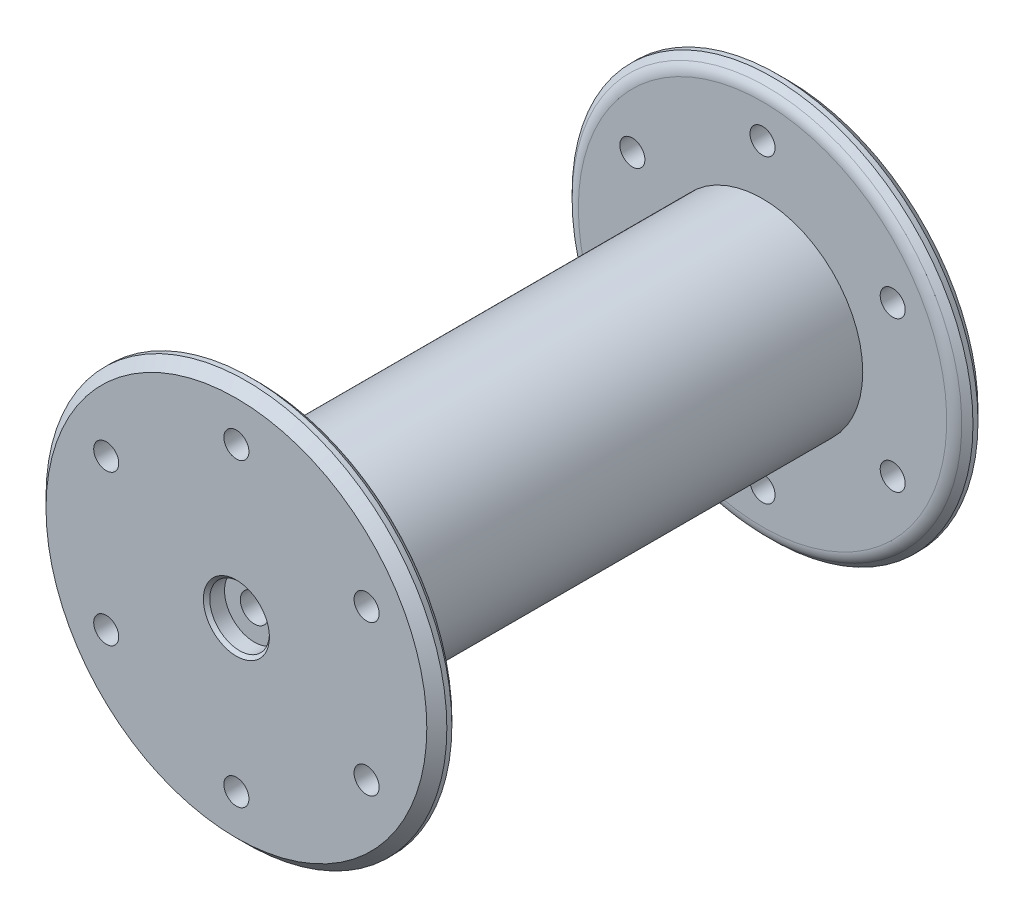
ISO-10303-21;
HEADER;
FILE_DESCRIPTION(('STEP AP214'),'2;1');
FILE_NAME('part.step','',(''),(''),'','','');
FILE_SCHEMA(('AUTOMOTIVE_DESIGN { 1 0 10303 214 1 1 1 1 }'));
ENDSEC;
DATA;
#1=APPLICATION_CONTEXT('core data for automotive mechanical design processes');
#2=APPLICATION_PROTOCOL_DEFINITION('international standard','automotive_design',2000,#1);
#3=PRODUCT_CONTEXT('',#1,'mechanical');
#4=PRODUCT('Part','Part','',(#3));
#5=PRODUCT_RELATED_PRODUCT_CATEGORY('part','',(#4));
#6=PRODUCT_DEFINITION_FORMATION('','',#4);
#7=PRODUCT_DEFINITION_CONTEXT('part definition',#1,'design');
#8=PRODUCT_DEFINITION('design','',#6,#7);
#9=PRODUCT_DEFINITION_SHAPE('','',#8);
#10=(LENGTH_UNIT() NAMED_UNIT(*) SI_UNIT(.MILLI.,.METRE.));
#11=(NAMED_UNIT(*) PLANE_ANGLE_UNIT() SI_UNIT($,.RADIAN.));
#12=(NAMED_UNIT(*) SI_UNIT($,.STERADIAN.) SOLID_ANGLE_UNIT());
#13=UNCERTAINTY_MEASURE_WITH_UNIT(LENGTH_MEASURE(1.E-05),#10,'distance_accuracy_value','');
#14=(GEOMETRIC_REPRESENTATION_CONTEXT(3) GLOBAL_UNCERTAINTY_ASSIGNED_CONTEXT((#13)) GLOBAL_UNIT_ASSIGNED_CONTEXT((#10,
#11,#12)) REPRESENTATION_CONTEXT('',''));
#15=CARTESIAN_POINT('',(0.,0.,0.));
#16=DIRECTION('',(0.,0.,1.));
#17=DIRECTION('',(1.,0.,0.));
#18=AXIS2_PLACEMENT_3D('',#15,#16,#17);
#19=CARTESIAN_POINT('',(0.,0.,55.));
#20=DIRECTION('',(0.,0.,1.));
#21=DIRECTION('',(1.,0.,0.));
#22=AXIS2_PLACEMENT_3D('',#19,#20,#21);
#23=CYLINDRICAL_SURFACE('',#22,2.80669999999999);
#24=CARTESIAN_POINT('',(0.,0.,51.4186));
#25=DIRECTION('',(0.,0.,1.));
#26=DIRECTION('',(1.,0.,0.));
#27=AXIS2_PLACEMENT_3D('',#24,#25,#26);
#28=CIRCLE('',#27,2.8067);
#29=CARTESIAN_POINT('',(2.8067,0.,51.4186));
#30=VERTEX_POINT('',#29);
#31=EDGE_CURVE('E160',#30,#30,#28,.T.);
#32=ORIENTED_EDGE('',*,*,#31,.T.);
#33=EDGE_LOOP('',(#32));
#34=FACE_BOUND('',#33,.T.);
#35=CARTESIAN_POINT('',(0.,0.,-51.4186));
#36=DIRECTION('',(0.,0.,-1.));
#37=DIRECTION('',(-1.,0.,0.));
#38=AXIS2_PLACEMENT_3D('',#35,#36,#37);
#39=CIRCLE('',#38,2.8067);
#40=CARTESIAN_POINT('',(-2.8067,0.,-51.4186));
#41=VERTEX_POINT('',#40);
#42=EDGE_CURVE('E207',#41,#41,#39,.T.);
#43=ORIENTED_EDGE('',*,*,#42,.T.);
#44=EDGE_LOOP('',(#43));
#45=FACE_BOUND('',#44,.T.);
#46=ADVANCED_FACE('F39',(#34,#45),#23,.F.);
#47=CARTESIAN_POINT('',(0.,0.,50.));
#48=DIRECTION('',(0.,0.,-1.));
#49=DIRECTION('',(-1.,0.,0.));
#50=AXIS2_PLACEMENT_3D('',#47,#48,#49);
#51=CYLINDRICAL_SURFACE('',#50,20.);
#52=CARTESIAN_POINT('',(0.,0.,50.));
#53=DIRECTION('',(0.,0.,1.));
#54=DIRECTION('',(1.,0.,0.));
#55=AXIS2_PLACEMENT_3D('',#52,#53,#54);
#56=CIRCLE('',#55,20.);
#57=CARTESIAN_POINT('',(20.,0.,50.));
#58=VERTEX_POINT('',#57);
#59=EDGE_CURVE('E129',#58,#58,#56,.T.);
#60=ORIENTED_EDGE('',*,*,#59,.F.);
#61=EDGE_LOOP('',(#60));
#62=FACE_BOUND('',#61,.T.);
#63=CARTESIAN_POINT('',(0.,0.,-50.));
#64=DIRECTION('',(0.,0.,1.));
#65=DIRECTION('',(1.,0.,0.));
#66=AXIS2_PLACEMENT_3D('',#63,#64,#65);
#67=CIRCLE('',#66,20.);
#68=CARTESIAN_POINT('',(20.,0.,-50.));
#69=VERTEX_POINT('',#68);
#70=EDGE_CURVE('E85',#69,#69,#67,.T.);
#71=ORIENTED_EDGE('',*,*,#70,.T.);
#72=EDGE_LOOP('',(#71));
#73=FACE_BOUND('',#72,.T.);
#74=ADVANCED_FACE('F265',(#62,#73),#51,.T.);
#75=CARTESIAN_POINT('',(0.,0.,55.));
#76=DIRECTION('',(0.,0.,-1.));
#77=DIRECTION('',(-1.,0.,0.));
#78=AXIS2_PLACEMENT_3D('',#75,#76,#77);
#79=CYLINDRICAL_SURFACE('',#78,40.);
#80=CARTESIAN_POINT('',(0.,0.,52.));
#81=DIRECTION('',(0.,0.,1.));
#82=DIRECTION('',(1.,0.,0.));
#83=AXIS2_PLACEMENT_3D('',#80,#81,#82);
#84=CIRCLE('',#83,40.);
#85=CARTESIAN_POINT('',(40.,0.,52.));
#86=VERTEX_POINT('',#85);
#87=EDGE_CURVE('E133',#86,#86,#84,.T.);
#88=ORIENTED_EDGE('',*,*,#87,.T.);
#89=EDGE_LOOP('',(#88));
#90=FACE_BOUND('',#89,.T.);
#91=CARTESIAN_POINT('',(0.,0.,53.));
#92=DIRECTION('',(0.,0.,1.));
#93=DIRECTION('',(1.,0.,0.));
#94=AXIS2_PLACEMENT_3D('',#91,#92,#93);
#95=CIRCLE('',#94,40.);
#96=CARTESIAN_POINT('',(40.,0.,53.));
#97=VERTEX_POINT('',#96);
#98=EDGE_CURVE('E137',#97,#97,#95,.F.);
#99=ORIENTED_EDGE('',*,*,#98,.T.);
#100=EDGE_LOOP('',(#99));
#101=FACE_BOUND('',#100,.T.);
#102=ADVANCED_FACE('F271',(#90,#101),#79,.T.);
#103=CARTESIAN_POINT('',(0.,0.,55.));
#104=DIRECTION('',(0.,0.,1.));
#105=DIRECTION('',(1.,0.,0.));
#106=AXIS2_PLACEMENT_3D('',#103,#104,#105);
#107=PLANE('',#106);
#108=CARTESIAN_POINT('',(0.,0.,55.));
#109=DIRECTION('',(0.,0.,1.));
#110=DIRECTION('',(1.,0.,0.));
#111=AXIS2_PLACEMENT_3D('',#108,#109,#110);
#112=CIRCLE('',#111,6.58876);
#113=CARTESIAN_POINT('',(6.58876,0.,55.));
#114=VERTEX_POINT('',#113);
#115=EDGE_CURVE('E144',#114,#114,#112,.T.);
#116=ORIENTED_EDGE('',*,*,#115,.F.);
#117=EDGE_LOOP('',(#116));
#118=FACE_BOUND('',#117,.T.);
#119=CARTESIAN_POINT('',(25.980762113533,15.0000000000003,55.));
#120=DIRECTION('',(0.,0.,1.));
#121=DIRECTION('',(0.50000000000001,-0.866025403784433,0.));
#122=AXIS2_PLACEMENT_3D('',#119,#120,#121);
#123=CIRCLE('',#122,2.5);
#124=CARTESIAN_POINT('',(27.230762113533,12.8349364905392,55.));
#125=VERTEX_POINT('',#124);
#126=EDGE_CURVE('E155',#125,#125,#123,.T.);
#127=ORIENTED_EDGE('',*,*,#126,.F.);
#128=EDGE_LOOP('',(#127));
#129=FACE_BOUND('',#128,.T.);
#130=CARTESIAN_POINT('',(25.9807621135333,-14.9999999999998,55.));
#131=DIRECTION('',(0.,0.,1.));
#132=DIRECTION('',(-0.499999999999992,-0.866025403784443,0.));
#133=AXIS2_PLACEMENT_3D('',#130,#131,#132);
#134=CIRCLE('',#133,2.5);
#135=CARTESIAN_POINT('',(24.7307621135333,-17.1650635094609,55.));
#136=VERTEX_POINT('',#135);
#137=EDGE_CURVE('E159',#136,#136,#134,.T.);
#138=ORIENTED_EDGE('',*,*,#137,.F.);
#139=EDGE_LOOP('',(#138));
#140=FACE_BOUND('',#139,.T.);
#141=CARTESIAN_POINT('',(0.,-30.,55.));
#142=DIRECTION('',(0.,0.,1.));
#143=DIRECTION('',(-1.,0.,0.));
#144=AXIS2_PLACEMENT_3D('',#141,#142,#143);
#145=CIRCLE('',#144,2.5);
#146=CARTESIAN_POINT('',(-2.5,-30.,55.));
#147=VERTEX_POINT('',#146);
#148=EDGE_CURVE('E164',#147,#147,#145,.T.);
#149=ORIENTED_EDGE('',*,*,#148,.F.);
#150=EDGE_LOOP('',(#149));
#151=FACE_BOUND('',#150,.T.);
#152=CARTESIAN_POINT('',(-25.9807621135331,-15.0000000000001,55.));
#153=DIRECTION('',(0.,0.,1.));
#154=DIRECTION('',(-0.500000000000004,0.866025403784436,0.));
#155=AXIS2_PLACEMENT_3D('',#152,#153,#154);
#156=CIRCLE('',#155,2.5);
#157=CARTESIAN_POINT('',(-27.2307621135331,-12.834936490539,55.));
#158=VERTEX_POINT('',#157);
#159=EDGE_CURVE('E154',#158,#158,#156,.T.);
#160=ORIENTED_EDGE('',*,*,#159,.F.);
#161=EDGE_LOOP('',(#160));
#162=FACE_BOUND('',#161,.T.);
#163=CARTESIAN_POINT('',(-25.9807621135332,14.9999999999999,55.));
#164=DIRECTION('',(0.,0.,1.));
#165=DIRECTION('',(0.499999999999998,0.86602540378444,0.));
#166=AXIS2_PLACEMENT_3D('',#163,#164,#165);
#167=CIRCLE('',#166,2.5);
#168=CARTESIAN_POINT('',(-24.7307621135332,17.165063509461,55.));
#169=VERTEX_POINT('',#168);
#170=EDGE_CURVE('E124',#169,#169,#167,.T.);
#171=ORIENTED_EDGE('',*,*,#170,.F.);
#172=EDGE_LOOP('',(#171));
#173=FACE_BOUND('',#172,.T.);
#174=CARTESIAN_POINT('',(0.,30.,55.));
#175=DIRECTION('',(0.,0.,1.));
#176=DIRECTION('',(1.,0.,0.));
#177=AXIS2_PLACEMENT_3D('',#174,#175,#176);
#178=CIRCLE('',#177,2.5);
#179=CARTESIAN_POINT('',(2.5,30.,55.));
#180=VERTEX_POINT('',#179);
#181=EDGE_CURVE('E107',#180,#180,#178,.T.);
#182=ORIENTED_EDGE('',*,*,#181,.F.);
#183=EDGE_LOOP('',(#182));
#184=FACE_BOUND('',#183,.T.);
#185=CARTESIAN_POINT('',(0.,0.,55.));
#186=DIRECTION('',(0.,0.,1.));
#187=DIRECTION('',(1.,0.,0.));
#188=AXIS2_PLACEMENT_3D('',#185,#186,#187);
#189=CIRCLE('',#188,38.);
#190=CARTESIAN_POINT('',(38.,0.,55.));
#191=VERTEX_POINT('',#190);
#192=EDGE_CURVE('E102',#191,#191,#189,.T.);
#193=ORIENTED_EDGE('',*,*,#192,.T.);
#194=EDGE_LOOP('',(#193));
#195=FACE_BOUND('',#194,.T.);
#196=ADVANCED_FACE('F305',(#118,#129,#140,#151,#162,#173,#184,#195),#107,.T.);
#197=CARTESIAN_POINT('',(0.,0.,50.));
#198=DIRECTION('',(0.,0.,1.));
#199=DIRECTION('',(1.,0.,0.));
#200=AXIS2_PLACEMENT_3D('',#197,#198,#199);
#201=PLANE('',#200);
#202=CARTESIAN_POINT('',(0.,0.,50.));
#203=DIRECTION('',(0.,0.,1.));
#204=DIRECTION('',(1.,0.,0.));
#205=AXIS2_PLACEMENT_3D('',#202,#203,#204);
#206=CIRCLE('',#205,36.7573593128807);
#207=CARTESIAN_POINT('',(36.7573593128807,0.,50.));
#208=VERTEX_POINT('',#207);
#209=EDGE_CURVE('E98',#208,#208,#206,.F.);
#210=ORIENTED_EDGE('',*,*,#209,.T.);
#211=EDGE_LOOP('',(#210));
#212=FACE_BOUND('',#211,.T.);
#213=CARTESIAN_POINT('',(25.980762113533,15.0000000000003,50.));
#214=DIRECTION('',(0.,0.,1.));
#215=DIRECTION('',(1.,0.,0.));
#216=AXIS2_PLACEMENT_3D('',#213,#214,#215);
#217=CIRCLE('',#216,2.5);
#218=CARTESIAN_POINT('',(28.480762113533,15.0000000000003,50.));
#219=VERTEX_POINT('',#218);
#220=EDGE_CURVE('E103',#219,#219,#217,.T.);
#221=ORIENTED_EDGE('',*,*,#220,.T.);
#222=EDGE_LOOP('',(#221));
#223=FACE_BOUND('',#222,.T.);
#224=CARTESIAN_POINT('',(25.9807621135333,-14.9999999999998,50.));
#225=DIRECTION('',(0.,0.,1.));
#226=DIRECTION('',(1.,0.,0.));
#227=AXIS2_PLACEMENT_3D('',#224,#225,#226);
#228=CIRCLE('',#227,2.5);
#229=CARTESIAN_POINT('',(28.4807621135333,-14.9999999999998,50.));
#230=VERTEX_POINT('',#229);
#231=EDGE_CURVE('E108',#230,#230,#228,.T.);
#232=ORIENTED_EDGE('',*,*,#231,.T.);
#233=EDGE_LOOP('',(#232));
#234=FACE_BOUND('',#233,.T.);
#235=CARTESIAN_POINT('',(0.,-30.,50.));
#236=DIRECTION('',(0.,0.,1.));
#237=DIRECTION('',(1.,0.,0.));
#238=AXIS2_PLACEMENT_3D('',#235,#236,#237);
#239=CIRCLE('',#238,2.5);
#240=CARTESIAN_POINT('',(2.5,-30.,50.));
#241=VERTEX_POINT('',#240);
#242=EDGE_CURVE('E112',#241,#241,#239,.T.);
#243=ORIENTED_EDGE('',*,*,#242,.T.);
#244=EDGE_LOOP('',(#243));
#245=FACE_BOUND('',#244,.T.);
#246=CARTESIAN_POINT('',(-25.9807621135331,-15.0000000000001,50.));
#247=DIRECTION('',(0.,0.,1.));
#248=DIRECTION('',(1.,0.,0.));
#249=AXIS2_PLACEMENT_3D('',#246,#247,#248);
#250=CIRCLE('',#249,2.5);
#251=CARTESIAN_POINT('',(-23.4807621135331,-15.0000000000001,50.));
#252=VERTEX_POINT('',#251);
#253=EDGE_CURVE('E116',#252,#252,#250,.T.);
#254=ORIENTED_EDGE('',*,*,#253,.T.);
#255=EDGE_LOOP('',(#254));
#256=FACE_BOUND('',#255,.T.);
#257=CARTESIAN_POINT('',(-25.9807621135332,14.9999999999999,50.));
#258=DIRECTION('',(0.,0.,1.));
#259=DIRECTION('',(1.,0.,0.));
#260=AXIS2_PLACEMENT_3D('',#257,#258,#259);
#261=CIRCLE('',#260,2.5);
#262=CARTESIAN_POINT('',(-23.4807621135332,14.9999999999999,50.));
#263=VERTEX_POINT('',#262);
#264=EDGE_CURVE('E120',#263,#263,#261,.T.);
#265=ORIENTED_EDGE('',*,*,#264,.T.);
#266=EDGE_LOOP('',(#265));
#267=FACE_BOUND('',#266,.T.);
#268=CARTESIAN_POINT('',(0.,30.,50.));
#269=DIRECTION('',(0.,0.,1.));
#270=DIRECTION('',(1.,0.,0.));
#271=AXIS2_PLACEMENT_3D('',#268,#269,#270);
#272=CIRCLE('',#271,2.5);
#273=CARTESIAN_POINT('',(2.5,30.,50.));
#274=VERTEX_POINT('',#273);
#275=EDGE_CURVE('E125',#274,#274,#272,.T.);
#276=ORIENTED_EDGE('',*,*,#275,.T.);
#277=EDGE_LOOP('',(#276));
#278=FACE_BOUND('',#277,.T.);
#279=ORIENTED_EDGE('',*,*,#59,.T.);
#280=EDGE_LOOP('',(#279));
#281=FACE_BOUND('',#280,.T.);
#282=ADVANCED_FACE('F308',(#212,#223,#234,#245,#256,#267,#278,#281),#201,.F.);
#283=CARTESIAN_POINT('',(0.,0.,52.));
#284=DIRECTION('',(0.,0.,1.));
#285=DIRECTION('',(1.,0.,0.));
#286=AXIS2_PLACEMENT_3D('',#283,#284,#285);
#287=CONICAL_SURFACE('',#286,40.,0.785398163397448);
#288=CARTESIAN_POINT('',(0.,0.,50.8786796564404));
#289=DIRECTION('',(0.,0.,1.));
#290=DIRECTION('',(1.,0.,0.));
#291=AXIS2_PLACEMENT_3D('',#288,#289,#290);
#292=CIRCLE('',#291,38.8786796564403);
#293=CARTESIAN_POINT('',(38.8786796564403,0.,50.8786796564404));
#294=VERTEX_POINT('',#293);
#295=EDGE_CURVE('E94',#294,#294,#292,.T.);
#296=ORIENTED_EDGE('',*,*,#295,.T.);
#297=EDGE_LOOP('',(#296));
#298=FACE_BOUND('',#297,.T.);
#299=ORIENTED_EDGE('',*,*,#87,.F.);
#300=EDGE_LOOP('',(#299));
#301=FACE_BOUND('',#300,.T.);
#302=ADVANCED_FACE('F312',(#298,#301),#287,.T.);
#303=CARTESIAN_POINT('',(0.,0.,55.));
#304=DIRECTION('',(0.,0.,-1.));
#305=DIRECTION('',(-1.,0.,0.));
#306=AXIS2_PLACEMENT_3D('',#303,#304,#305);
#307=CONICAL_SURFACE('',#306,38.,0.78539816339744);
#308=ORIENTED_EDGE('',*,*,#98,.F.);
#309=EDGE_LOOP('',(#308));
#310=FACE_BOUND('',#309,.T.);
#311=ORIENTED_EDGE('',*,*,#192,.F.);
#312=EDGE_LOOP('',(#311));
#313=FACE_BOUND('',#312,.T.);
#314=ADVANCED_FACE('F303',(#310,#313),#307,.T.);
#315=CARTESIAN_POINT('',(0.,30.,-50.));
#316=DIRECTION('',(0.,0.,1.));
#317=DIRECTION('',(1.,0.,0.));
#318=AXIS2_PLACEMENT_3D('',#315,#316,#317);
#319=CYLINDRICAL_SURFACE('',#318,2.5);
#320=ORIENTED_EDGE('',*,*,#181,.T.);
#321=EDGE_LOOP('',(#320));
#322=FACE_BOUND('',#321,.T.);
#323=ORIENTED_EDGE('',*,*,#275,.F.);
#324=EDGE_LOOP('',(#323));
#325=FACE_BOUND('',#324,.T.);
#326=ADVANCED_FACE('F299',(#322,#325),#319,.F.);
#327=CARTESIAN_POINT('',(-25.9807621135332,14.9999999999999,-50.));
#328=DIRECTION('',(0.,0.,1.));
#329=DIRECTION('',(1.,0.,0.));
#330=AXIS2_PLACEMENT_3D('',#327,#328,#329);
#331=CYLINDRICAL_SURFACE('',#330,2.5);
#332=ORIENTED_EDGE('',*,*,#170,.T.);
#333=EDGE_LOOP('',(#332));
#334=FACE_BOUND('',#333,.T.);
#335=ORIENTED_EDGE('',*,*,#264,.F.);
#336=EDGE_LOOP('',(#335));
#337=FACE_BOUND('',#336,.T.);
#338=ADVANCED_FACE('F283',(#334,#337),#331,.F.);
#339=CARTESIAN_POINT('',(-25.9807621135331,-15.0000000000001,-50.));
#340=DIRECTION('',(0.,0.,1.));
#341=DIRECTION('',(1.,0.,0.));
#342=AXIS2_PLACEMENT_3D('',#339,#340,#341);
#343=CYLINDRICAL_SURFACE('',#342,2.5);
#344=ORIENTED_EDGE('',*,*,#159,.T.);
#345=EDGE_LOOP('',(#344));
#346=FACE_BOUND('',#345,.T.);
#347=ORIENTED_EDGE('',*,*,#253,.F.);
#348=EDGE_LOOP('',(#347));
#349=FACE_BOUND('',#348,.T.);
#350=ADVANCED_FACE('F279',(#346,#349),#343,.F.);
#351=CARTESIAN_POINT('',(0.,-30.,-50.));
#352=DIRECTION('',(0.,0.,1.));
#353=DIRECTION('',(1.,0.,0.));
#354=AXIS2_PLACEMENT_3D('',#351,#352,#353);
#355=CYLINDRICAL_SURFACE('',#354,2.5);
#356=ORIENTED_EDGE('',*,*,#148,.T.);
#357=EDGE_LOOP('',(#356));
#358=FACE_BOUND('',#357,.T.);
#359=ORIENTED_EDGE('',*,*,#242,.F.);
#360=EDGE_LOOP('',(#359));
#361=FACE_BOUND('',#360,.T.);
#362=ADVANCED_FACE('F282',(#358,#361),#355,.F.);
#363=CARTESIAN_POINT('',(25.9807621135333,-14.9999999999998,-50.));
#364=DIRECTION('',(0.,0.,1.));
#365=DIRECTION('',(1.,0.,0.));
#366=AXIS2_PLACEMENT_3D('',#363,#364,#365);
#367=CYLINDRICAL_SURFACE('',#366,2.5);
#368=ORIENTED_EDGE('',*,*,#137,.T.);
#369=EDGE_LOOP('',(#368));
#370=FACE_BOUND('',#369,.T.);
#371=ORIENTED_EDGE('',*,*,#231,.F.);
#372=EDGE_LOOP('',(#371));
#373=FACE_BOUND('',#372,.T.);
#374=ADVANCED_FACE('F287',(#370,#373),#367,.F.);
#375=CARTESIAN_POINT('',(25.980762113533,15.0000000000003,-50.));
#376=DIRECTION('',(0.,0.,1.));
#377=DIRECTION('',(1.,0.,0.));
#378=AXIS2_PLACEMENT_3D('',#375,#376,#377);
#379=CYLINDRICAL_SURFACE('',#378,2.5);
#380=ORIENTED_EDGE('',*,*,#126,.T.);
#381=EDGE_LOOP('',(#380));
#382=FACE_BOUND('',#381,.T.);
#383=ORIENTED_EDGE('',*,*,#220,.F.);
#384=EDGE_LOOP('',(#383));
#385=FACE_BOUND('',#384,.T.);
#386=ADVANCED_FACE('F291',(#382,#385),#379,.F.);
#387=CARTESIAN_POINT('',(0.,0.,53.));
#388=DIRECTION('',(0.,0.,1.));
#389=DIRECTION('',(1.,0.,0.));
#390=AXIS2_PLACEMENT_3D('',#387,#388,#389);
#391=TOROIDAL_SURFACE('',#390,36.7573593128807,3.);
#392=ORIENTED_EDGE('',*,*,#295,.F.);
#393=EDGE_LOOP('',(#392));
#394=FACE_BOUND('',#393,.T.);
#395=ORIENTED_EDGE('',*,*,#209,.F.);
#396=EDGE_LOOP('',(#395));
#397=FACE_BOUND('',#396,.T.);
#398=ADVANCED_FACE('F295',(#394,#397),#391,.T.);
#399=CARTESIAN_POINT('',(5.95376,0.,51.4186));
#400=DIRECTION('',(0.,0.,-1.));
#401=DIRECTION('',(-1.,0.,0.));
#402=AXIS2_PLACEMENT_3D('',#399,#400,#401);
#403=PLANE('',#402);
#404=ORIENTED_EDGE('',*,*,#31,.F.);
#405=EDGE_LOOP('',(#404));
#406=FACE_BOUND('',#405,.T.);
#407=CARTESIAN_POINT('',(0.,0.,51.4186));
#408=DIRECTION('',(0.,0.,1.));
#409=DIRECTION('',(1.,0.,0.));
#410=AXIS2_PLACEMENT_3D('',#407,#408,#409);
#411=CIRCLE('',#410,5.95376);
#412=CARTESIAN_POINT('',(5.95376,0.,51.4186));
#413=VERTEX_POINT('',#412);
#414=EDGE_CURVE('E174',#413,#413,#411,.T.);
#415=ORIENTED_EDGE('',*,*,#414,.T.);
#416=EDGE_LOOP('',(#415));
#417=FACE_BOUND('',#416,.T.);
#418=ADVANCED_FACE('F277',(#406,#417),#403,.F.);
#419=CARTESIAN_POINT('',(0.,0.,55.));
#420=DIRECTION('',(0.,0.,1.));
#421=DIRECTION('',(1.,0.,0.));
#422=AXIS2_PLACEMENT_3D('',#419,#420,#421);
#423=CYLINDRICAL_SURFACE('',#422,5.95376);
#424=ORIENTED_EDGE('',*,*,#414,.F.);
#425=EDGE_LOOP('',(#424));
#426=FACE_BOUND('',#425,.T.);
#427=CARTESIAN_POINT('',(0.,0.,54.365));
#428=DIRECTION('',(0.,0.,1.));
#429=DIRECTION('',(1.,0.,0.));
#430=AXIS2_PLACEMENT_3D('',#427,#428,#429);
#431=CIRCLE('',#430,5.95376);
#432=CARTESIAN_POINT('',(5.95376,0.,54.365));
#433=VERTEX_POINT('',#432);
#434=EDGE_CURVE('E178',#433,#433,#431,.T.);
#435=ORIENTED_EDGE('',*,*,#434,.T.);
#436=EDGE_LOOP('',(#435));
#437=FACE_BOUND('',#436,.T.);
#438=ADVANCED_FACE('F260',(#426,#437),#423,.F.);
#439=CARTESIAN_POINT('',(0.,0.,55.));
#440=DIRECTION('',(0.,0.,1.));
#441=DIRECTION('',(1.,0.,0.));
#442=AXIS2_PLACEMENT_3D('',#439,#440,#441);
#443=CONICAL_SURFACE('',#442,6.58876,0.785398163397446);
#444=ORIENTED_EDGE('',*,*,#434,.F.);
#445=EDGE_LOOP('',(#444));
#446=FACE_BOUND('',#445,.T.);
#447=ORIENTED_EDGE('',*,*,#115,.T.);
#448=EDGE_LOOP('',(#447));
#449=FACE_BOUND('',#448,.T.);
#450=ADVANCED_FACE('F254',(#446,#449),#443,.F.);
#451=CARTESIAN_POINT('',(0.,0.,-55.));
#452=DIRECTION('',(0.,0.,1.));
#453=DIRECTION('',(1.,0.,0.));
#454=AXIS2_PLACEMENT_3D('',#451,#452,#453);
#455=CYLINDRICAL_SURFACE('',#454,40.);
#456=CARTESIAN_POINT('',(0.,0.,-52.));
#457=DIRECTION('',(0.,0.,-1.));
#458=DIRECTION('',(-1.,0.,0.));
#459=AXIS2_PLACEMENT_3D('',#456,#457,#458);
#460=CIRCLE('',#459,40.);
#461=CARTESIAN_POINT('',(-40.,0.,-52.));
#462=VERTEX_POINT('',#461);
#463=EDGE_CURVE('E57',#462,#462,#460,.T.);
#464=ORIENTED_EDGE('',*,*,#463,.T.);
#465=EDGE_LOOP('',(#464));
#466=FACE_BOUND('',#465,.T.);
#467=CARTESIAN_POINT('',(0.,0.,-53.));
#468=DIRECTION('',(0.,0.,-1.));
#469=DIRECTION('',(-1.,0.,0.));
#470=AXIS2_PLACEMENT_3D('',#467,#468,#469);
#471=CIRCLE('',#470,40.);
#472=CARTESIAN_POINT('',(-40.,0.,-53.));
#473=VERTEX_POINT('',#472);
#474=EDGE_CURVE('E90',#473,#473,#471,.F.);
#475=ORIENTED_EDGE('',*,*,#474,.T.);
#476=EDGE_LOOP('',(#475));
#477=FACE_BOUND('',#476,.T.);
#478=ADVANCED_FACE('F230',(#466,#477),#455,.T.);
#479=CARTESIAN_POINT('',(0.,0.,-55.));
#480=DIRECTION('',(0.,0.,-1.));
#481=DIRECTION('',(1.,0.,0.));
#482=AXIS2_PLACEMENT_3D('',#479,#480,#481);
#483=PLANE('',#482);
#484=CARTESIAN_POINT('',(0.,0.,-55.));
#485=DIRECTION('',(0.,0.,-1.));
#486=DIRECTION('',(-1.,0.,0.));
#487=AXIS2_PLACEMENT_3D('',#484,#485,#486);
#488=CIRCLE('',#487,6.58876);
#489=CARTESIAN_POINT('',(-6.58876,0.,-55.));
#490=VERTEX_POINT('',#489);
#491=EDGE_CURVE('E219',#490,#490,#488,.T.);
#492=ORIENTED_EDGE('',*,*,#491,.F.);
#493=EDGE_LOOP('',(#492));
#494=FACE_BOUND('',#493,.T.);
#495=CARTESIAN_POINT('',(25.980762113533,15.0000000000003,-55.));
#496=DIRECTION('',(0.,0.,1.));
#497=DIRECTION('',(0.50000000000001,-0.866025403784433,0.));
#498=AXIS2_PLACEMENT_3D('',#495,#496,#497);
#499=CIRCLE('',#498,2.5);
#500=CARTESIAN_POINT('',(27.230762113533,12.8349364905392,-55.));
#501=VERTEX_POINT('',#500);
#502=EDGE_CURVE('E193',#501,#501,#499,.T.);
#503=ORIENTED_EDGE('',*,*,#502,.T.);
#504=EDGE_LOOP('',(#503));
#505=FACE_BOUND('',#504,.T.);
#506=CARTESIAN_POINT('',(25.9807621135333,-14.9999999999998,-55.));
#507=DIRECTION('',(0.,0.,1.));
#508=DIRECTION('',(-0.499999999999992,-0.866025403784443,0.));
#509=AXIS2_PLACEMENT_3D('',#506,#507,#508);
#510=CIRCLE('',#509,2.5);
#511=CARTESIAN_POINT('',(24.7307621135333,-17.1650635094609,-55.));
#512=VERTEX_POINT('',#511);
#513=EDGE_CURVE('E188',#512,#512,#510,.T.);
#514=ORIENTED_EDGE('',*,*,#513,.T.);
#515=EDGE_LOOP('',(#514));
#516=FACE_BOUND('',#515,.T.);
#517=CARTESIAN_POINT('',(0.,-30.,-55.));
#518=DIRECTION('',(0.,0.,1.));
#519=DIRECTION('',(-1.,0.,0.));
#520=AXIS2_PLACEMENT_3D('',#517,#518,#519);
#521=CIRCLE('',#520,2.5);
#522=CARTESIAN_POINT('',(-2.5,-30.,-55.));
#523=VERTEX_POINT('',#522);
#524=EDGE_CURVE('E192',#523,#523,#521,.T.);
#525=ORIENTED_EDGE('',*,*,#524,.T.);
#526=EDGE_LOOP('',(#525));
#527=FACE_BOUND('',#526,.T.);
#528=CARTESIAN_POINT('',(-25.9807621135331,-15.0000000000001,-55.));
#529=DIRECTION('',(0.,0.,1.));
#530=DIRECTION('',(-0.500000000000004,0.866025403784436,0.));
#531=AXIS2_PLACEMENT_3D('',#528,#529,#530);
#532=CIRCLE('',#531,2.5);
#533=CARTESIAN_POINT('',(-27.2307621135331,-12.834936490539,-55.));
#534=VERTEX_POINT('',#533);
#535=EDGE_CURVE('E197',#534,#534,#532,.T.);
#536=ORIENTED_EDGE('',*,*,#535,.T.);
#537=EDGE_LOOP('',(#536));
#538=FACE_BOUND('',#537,.T.);
#539=CARTESIAN_POINT('',(-25.9807621135332,14.9999999999999,-55.));
#540=DIRECTION('',(0.,0.,1.));
#541=DIRECTION('',(0.499999999999998,0.86602540378444,0.));
#542=AXIS2_PLACEMENT_3D('',#539,#540,#541);
#543=CIRCLE('',#542,2.5);
#544=CARTESIAN_POINT('',(-24.7307621135332,17.165063509461,-55.));
#545=VERTEX_POINT('',#544);
#546=EDGE_CURVE('E81',#545,#545,#543,.T.);
#547=ORIENTED_EDGE('',*,*,#546,.T.);
#548=EDGE_LOOP('',(#547));
#549=FACE_BOUND('',#548,.T.);
#550=CARTESIAN_POINT('',(0.,30.,-55.));
#551=DIRECTION('',(0.,0.,1.));
#552=DIRECTION('',(1.,0.,0.));
#553=AXIS2_PLACEMENT_3D('',#550,#551,#552);
#554=CIRCLE('',#553,2.5);
#555=CARTESIAN_POINT('',(2.5,30.,-55.));
#556=VERTEX_POINT('',#555);
#557=EDGE_CURVE('E64',#556,#556,#554,.T.);
#558=ORIENTED_EDGE('',*,*,#557,.T.);
#559=EDGE_LOOP('',(#558));
#560=FACE_BOUND('',#559,.T.);
#561=CARTESIAN_POINT('',(0.,0.,-55.));
#562=DIRECTION('',(0.,0.,-1.));
#563=DIRECTION('',(-1.,0.,0.));
#564=AXIS2_PLACEMENT_3D('',#561,#562,#563);
#565=CIRCLE('',#564,38.);
#566=CARTESIAN_POINT('',(-38.,0.,-55.));
#567=VERTEX_POINT('',#566);
#568=EDGE_CURVE('E52',#567,#567,#565,.T.);
#569=ORIENTED_EDGE('',*,*,#568,.T.);
#570=EDGE_LOOP('',(#569));
#571=FACE_BOUND('',#570,.T.);
#572=ADVANCED_FACE('F226',(#494,#505,#516,#527,#538,#549,#560,#571),#483,.T.);
#573=CARTESIAN_POINT('',(0.,0.,-50.));
#574=DIRECTION('',(0.,0.,-1.));
#575=DIRECTION('',(1.,0.,0.));
#576=AXIS2_PLACEMENT_3D('',#573,#574,#575);
#577=PLANE('',#576);
#578=CARTESIAN_POINT('',(0.,0.,-50.));
#579=DIRECTION('',(0.,0.,-1.));
#580=DIRECTION('',(-1.,0.,0.));
#581=AXIS2_PLACEMENT_3D('',#578,#579,#580);
#582=CIRCLE('',#581,36.7573593128807);
#583=CARTESIAN_POINT('',(-36.7573593128807,0.,-50.));
#584=VERTEX_POINT('',#583);
#585=EDGE_CURVE('E47',#584,#584,#582,.F.);
#586=ORIENTED_EDGE('',*,*,#585,.T.);
#587=EDGE_LOOP('',(#586));
#588=FACE_BOUND('',#587,.T.);
#589=CARTESIAN_POINT('',(25.980762113533,15.0000000000003,-50.));
#590=DIRECTION('',(0.,0.,-1.));
#591=DIRECTION('',(-1.,0.,0.));
#592=AXIS2_PLACEMENT_3D('',#589,#590,#591);
#593=CIRCLE('',#592,2.5);
#594=CARTESIAN_POINT('',(23.480762113533,15.0000000000003,-50.));
#595=VERTEX_POINT('',#594);
#596=EDGE_CURVE('E60',#595,#595,#593,.F.);
#597=ORIENTED_EDGE('',*,*,#596,.F.);
#598=EDGE_LOOP('',(#597));
#599=FACE_BOUND('',#598,.T.);
#600=CARTESIAN_POINT('',(25.9807621135333,-14.9999999999998,-50.));
#601=DIRECTION('',(0.,0.,-1.));
#602=DIRECTION('',(-1.,0.,0.));
#603=AXIS2_PLACEMENT_3D('',#600,#601,#602);
#604=CIRCLE('',#603,2.5);
#605=CARTESIAN_POINT('',(23.4807621135333,-14.9999999999998,-50.));
#606=VERTEX_POINT('',#605);
#607=EDGE_CURVE('E65',#606,#606,#604,.F.);
#608=ORIENTED_EDGE('',*,*,#607,.F.);
#609=EDGE_LOOP('',(#608));
#610=FACE_BOUND('',#609,.T.);
#611=CARTESIAN_POINT('',(0.,-30.,-50.));
#612=DIRECTION('',(0.,0.,-1.));
#613=DIRECTION('',(-1.,0.,0.));
#614=AXIS2_PLACEMENT_3D('',#611,#612,#613);
#615=CIRCLE('',#614,2.5);
#616=CARTESIAN_POINT('',(-2.5,-30.,-50.));
#617=VERTEX_POINT('',#616);
#618=EDGE_CURVE('E69',#617,#617,#615,.F.);
#619=ORIENTED_EDGE('',*,*,#618,.F.);
#620=EDGE_LOOP('',(#619));
#621=FACE_BOUND('',#620,.T.);
#622=CARTESIAN_POINT('',(-25.9807621135331,-15.0000000000001,-50.));
#623=DIRECTION('',(0.,0.,-1.));
#624=DIRECTION('',(-1.,0.,0.));
#625=AXIS2_PLACEMENT_3D('',#622,#623,#624);
#626=CIRCLE('',#625,2.5);
#627=CARTESIAN_POINT('',(-28.4807621135331,-15.0000000000001,-50.));
#628=VERTEX_POINT('',#627);
#629=EDGE_CURVE('E73',#628,#628,#626,.F.);
#630=ORIENTED_EDGE('',*,*,#629,.F.);
#631=EDGE_LOOP('',(#630));
#632=FACE_BOUND('',#631,.T.);
#633=CARTESIAN_POINT('',(-25.9807621135332,14.9999999999999,-50.));
#634=DIRECTION('',(0.,0.,-1.));
#635=DIRECTION('',(-1.,0.,0.));
#636=AXIS2_PLACEMENT_3D('',#633,#634,#635);
#637=CIRCLE('',#636,2.5);
#638=CARTESIAN_POINT('',(-28.4807621135332,14.9999999999999,-50.));
#639=VERTEX_POINT('',#638);
#640=EDGE_CURVE('E77',#639,#639,#637,.F.);
#641=ORIENTED_EDGE('',*,*,#640,.F.);
#642=EDGE_LOOP('',(#641));
#643=FACE_BOUND('',#642,.T.);
#644=CARTESIAN_POINT('',(0.,30.,-50.));
#645=DIRECTION('',(0.,0.,-1.));
#646=DIRECTION('',(-1.,0.,0.));
#647=AXIS2_PLACEMENT_3D('',#644,#645,#646);
#648=CIRCLE('',#647,2.5);
#649=CARTESIAN_POINT('',(-2.5,30.,-50.));
#650=VERTEX_POINT('',#649);
#651=EDGE_CURVE('E82',#650,#650,#648,.F.);
#652=ORIENTED_EDGE('',*,*,#651,.F.);
#653=EDGE_LOOP('',(#652));
#654=FACE_BOUND('',#653,.T.);
#655=ORIENTED_EDGE('',*,*,#70,.F.);
#656=EDGE_LOOP('',(#655));
#657=FACE_BOUND('',#656,.T.);
#658=ADVANCED_FACE('F229',(#588,#599,#610,#621,#632,#643,#654,#657),#577,.F.);
#659=CARTESIAN_POINT('',(0.,0.,-50.));
#660=DIRECTION('',(0.,0.,-1.));
#661=DIRECTION('',(-1.,0.,0.));
#662=AXIS2_PLACEMENT_3D('',#659,#660,#661);
#663=CONICAL_SURFACE('',#662,38.,0.785398163397452);
#664=CARTESIAN_POINT('',(0.,0.,-50.8786796564404));
#665=DIRECTION('',(0.,0.,-1.));
#666=DIRECTION('',(-1.,0.,0.));
#667=AXIS2_PLACEMENT_3D('',#664,#665,#666);
#668=CIRCLE('',#667,38.8786796564404);
#669=CARTESIAN_POINT('',(-38.8786796564404,0.,-50.8786796564404));
#670=VERTEX_POINT('',#669);
#671=EDGE_CURVE('E10',#670,#670,#668,.T.);
#672=ORIENTED_EDGE('',*,*,#671,.T.);
#673=EDGE_LOOP('',(#672));
#674=FACE_BOUND('',#673,.T.);
#675=ORIENTED_EDGE('',*,*,#463,.F.);
#676=EDGE_LOOP('',(#675));
#677=FACE_BOUND('',#676,.T.);
#678=ADVANCED_FACE('F250',(#674,#677),#663,.T.);
#679=CARTESIAN_POINT('',(0.,0.,-53.));
#680=DIRECTION('',(0.,0.,1.));
#681=DIRECTION('',(1.,0.,0.));
#682=AXIS2_PLACEMENT_3D('',#679,#680,#681);
#683=CONICAL_SURFACE('',#682,40.,0.785398163397447);
#684=ORIENTED_EDGE('',*,*,#568,.F.);
#685=EDGE_LOOP('',(#684));
#686=FACE_BOUND('',#685,.T.);
#687=ORIENTED_EDGE('',*,*,#474,.F.);
#688=EDGE_LOOP('',(#687));
#689=FACE_BOUND('',#688,.T.);
#690=ADVANCED_FACE('F246',(#686,#689),#683,.T.);
#691=CARTESIAN_POINT('',(0.,30.,55.));
#692=DIRECTION('',(0.,0.,-1.));
#693=DIRECTION('',(-1.,0.,0.));
#694=AXIS2_PLACEMENT_3D('',#691,#692,#693);
#695=CYLINDRICAL_SURFACE('',#694,2.5);
#696=ORIENTED_EDGE('',*,*,#557,.F.);
#697=EDGE_LOOP('',(#696));
#698=FACE_BOUND('',#697,.T.);
#699=ORIENTED_EDGE('',*,*,#651,.T.);
#700=EDGE_LOOP('',(#699));
#701=FACE_BOUND('',#700,.T.);
#702=ADVANCED_FACE('F249',(#698,#701),#695,.F.);
#703=CARTESIAN_POINT('',(-25.9807621135332,14.9999999999999,55.));
#704=DIRECTION('',(0.,0.,-1.));
#705=DIRECTION('',(-1.,0.,0.));
#706=AXIS2_PLACEMENT_3D('',#703,#704,#705);
#707=CYLINDRICAL_SURFACE('',#706,2.5);
#708=ORIENTED_EDGE('',*,*,#546,.F.);
#709=EDGE_LOOP('',(#708));
#710=FACE_BOUND('',#709,.T.);
#711=ORIENTED_EDGE('',*,*,#640,.T.);
#712=EDGE_LOOP('',(#711));
#713=FACE_BOUND('',#712,.T.);
#714=ADVANCED_FACE('F338',(#710,#713),#707,.F.);
#715=CARTESIAN_POINT('',(-25.9807621135331,-15.0000000000001,55.));
#716=DIRECTION('',(0.,0.,-1.));
#717=DIRECTION('',(-1.,0.,0.));
#718=AXIS2_PLACEMENT_3D('',#715,#716,#717);
#719=CYLINDRICAL_SURFACE('',#718,2.5);
#720=ORIENTED_EDGE('',*,*,#535,.F.);
#721=EDGE_LOOP('',(#720));
#722=FACE_BOUND('',#721,.T.);
#723=ORIENTED_EDGE('',*,*,#629,.T.);
#724=EDGE_LOOP('',(#723));
#725=FACE_BOUND('',#724,.T.);
#726=ADVANCED_FACE('F348',(#722,#725),#719,.F.);
#727=CARTESIAN_POINT('',(0.,-30.,55.));
#728=DIRECTION('',(0.,0.,-1.));
#729=DIRECTION('',(-1.,0.,0.));
#730=AXIS2_PLACEMENT_3D('',#727,#728,#729);
#731=CYLINDRICAL_SURFACE('',#730,2.5);
#732=ORIENTED_EDGE('',*,*,#524,.F.);
#733=EDGE_LOOP('',(#732));
#734=FACE_BOUND('',#733,.T.);
#735=ORIENTED_EDGE('',*,*,#618,.T.);
#736=EDGE_LOOP('',(#735));
#737=FACE_BOUND('',#736,.T.);
#738=ADVANCED_FACE('F344',(#734,#737),#731,.F.);
#739=CARTESIAN_POINT('',(25.9807621135333,-14.9999999999998,55.));
#740=DIRECTION('',(0.,0.,-1.));
#741=DIRECTION('',(-1.,0.,0.));
#742=AXIS2_PLACEMENT_3D('',#739,#740,#741);
#743=CYLINDRICAL_SURFACE('',#742,2.5);
#744=ORIENTED_EDGE('',*,*,#513,.F.);
#745=EDGE_LOOP('',(#744));
#746=FACE_BOUND('',#745,.T.);
#747=ORIENTED_EDGE('',*,*,#607,.T.);
#748=EDGE_LOOP('',(#747));
#749=FACE_BOUND('',#748,.T.);
#750=ADVANCED_FACE('F340',(#746,#749),#743,.F.);
#751=CARTESIAN_POINT('',(25.980762113533,15.0000000000003,55.));
#752=DIRECTION('',(0.,0.,-1.));
#753=DIRECTION('',(-1.,0.,0.));
#754=AXIS2_PLACEMENT_3D('',#751,#752,#753);
#755=CYLINDRICAL_SURFACE('',#754,2.5);
#756=ORIENTED_EDGE('',*,*,#502,.F.);
#757=EDGE_LOOP('',(#756));
#758=FACE_BOUND('',#757,.T.);
#759=ORIENTED_EDGE('',*,*,#596,.T.);
#760=EDGE_LOOP('',(#759));
#761=FACE_BOUND('',#760,.T.);
#762=ADVANCED_FACE('F343',(#758,#761),#755,.F.);
#763=CARTESIAN_POINT('',(0.,0.,-53.));
#764=DIRECTION('',(0.,0.,-1.));
#765=DIRECTION('',(-1.,0.,0.));
#766=AXIS2_PLACEMENT_3D('',#763,#764,#765);
#767=TOROIDAL_SURFACE('',#766,36.7573593128807,3.);
#768=ORIENTED_EDGE('',*,*,#671,.F.);
#769=EDGE_LOOP('',(#768));
#770=FACE_BOUND('',#769,.T.);
#771=ORIENTED_EDGE('',*,*,#585,.F.);
#772=EDGE_LOOP('',(#771));
#773=FACE_BOUND('',#772,.T.);
#774=ADVANCED_FACE('F41',(#770,#773),#767,.T.);
#775=CARTESIAN_POINT('',(5.95376,0.,-51.4186));
#776=DIRECTION('',(0.,0.,1.));
#777=DIRECTION('',(1.,0.,0.));
#778=AXIS2_PLACEMENT_3D('',#775,#776,#777);
#779=PLANE('',#778);
#780=ORIENTED_EDGE('',*,*,#42,.F.);
#781=EDGE_LOOP('',(#780));
#782=FACE_BOUND('',#781,.T.);
#783=CARTESIAN_POINT('',(0.,0.,-51.4186));
#784=DIRECTION('',(0.,0.,-1.));
#785=DIRECTION('',(-1.,0.,0.));
#786=AXIS2_PLACEMENT_3D('',#783,#784,#785);
#787=CIRCLE('',#786,5.95376);
#788=CARTESIAN_POINT('',(-5.95376,0.,-51.4186));
#789=VERTEX_POINT('',#788);
#790=EDGE_CURVE('E211',#789,#789,#787,.T.);
#791=ORIENTED_EDGE('',*,*,#790,.T.);
#792=EDGE_LOOP('',(#791));
#793=FACE_BOUND('',#792,.T.);
#794=ADVANCED_FACE('F359',(#782,#793),#779,.F.);
#795=CARTESIAN_POINT('',(0.,0.,-55.));
#796=DIRECTION('',(0.,0.,-1.));
#797=DIRECTION('',(-1.,0.,0.));
#798=AXIS2_PLACEMENT_3D('',#795,#796,#797);
#799=CYLINDRICAL_SURFACE('',#798,5.95376);
#800=ORIENTED_EDGE('',*,*,#790,.F.);
#801=EDGE_LOOP('',(#800));
#802=FACE_BOUND('',#801,.T.);
#803=CARTESIAN_POINT('',(0.,0.,-54.365));
#804=DIRECTION('',(0.,0.,-1.));
#805=DIRECTION('',(-1.,0.,0.));
#806=AXIS2_PLACEMENT_3D('',#803,#804,#805);
#807=CIRCLE('',#806,5.95376);
#808=CARTESIAN_POINT('',(-5.95376,0.,-54.365));
#809=VERTEX_POINT('',#808);
#810=EDGE_CURVE('E215',#809,#809,#807,.T.);
#811=ORIENTED_EDGE('',*,*,#810,.T.);
#812=EDGE_LOOP('',(#811));
#813=FACE_BOUND('',#812,.T.);
#814=ADVANCED_FACE('F362',(#802,#813),#799,.F.);
#815=CARTESIAN_POINT('',(0.,0.,-55.));
#816=DIRECTION('',(0.,0.,-1.));
#817=DIRECTION('',(-1.,0.,0.));
#818=AXIS2_PLACEMENT_3D('',#815,#816,#817);
#819=CONICAL_SURFACE('',#818,6.58876,0.785398163397446);
#820=ORIENTED_EDGE('',*,*,#810,.F.);
#821=EDGE_LOOP('',(#820));
#822=FACE_BOUND('',#821,.T.);
#823=ORIENTED_EDGE('',*,*,#491,.T.);
#824=EDGE_LOOP('',(#823));
#825=FACE_BOUND('',#824,.T.);
#826=ADVANCED_FACE('F224',(#822,#825),#819,.F.);
#827=CLOSED_SHELL('',(#46,#74,#102,#196,#282,#302,#314,#326,#338,#350,#362,#374,#386,#398,#418,
#438,#450,#478,#572,#658,#678,#690,#702,#714,#726,#738,#750,#762,#774,#794,#814,#826));
#828=MANIFOLD_SOLID_BREP('B2',#827);
#829=ADVANCED_BREP_SHAPE_REPRESENTATION('',(#18,#828),#14);
#830=SHAPE_DEFINITION_REPRESENTATION(#9,#829);
ENDSEC;
END-ISO-10303-21;
